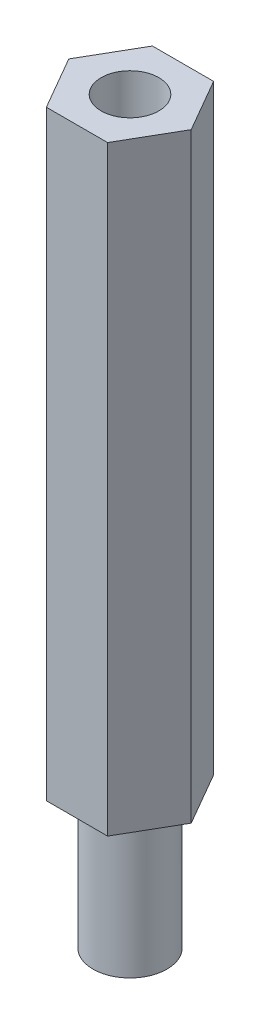
ISO-10303-21;
HEADER;
FILE_DESCRIPTION(('STEP AP214'),'2;1');
FILE_NAME('part.step','',(''),(''),'','','');
FILE_SCHEMA(('AUTOMOTIVE_DESIGN { 1 0 10303 214 1 1 1 1 }'));
ENDSEC;
DATA;
#1=APPLICATION_CONTEXT('core data for automotive mechanical design processes');
#2=APPLICATION_PROTOCOL_DEFINITION('international standard','automotive_design',2000,#1);
#3=PRODUCT_CONTEXT('',#1,'mechanical');
#4=PRODUCT('Part','Part','',(#3));
#5=PRODUCT_RELATED_PRODUCT_CATEGORY('part','',(#4));
#6=PRODUCT_DEFINITION_FORMATION('','',#4);
#7=PRODUCT_DEFINITION_CONTEXT('part definition',#1,'design');
#8=PRODUCT_DEFINITION('design','',#6,#7);
#9=PRODUCT_DEFINITION_SHAPE('','',#8);
#10=(LENGTH_UNIT() NAMED_UNIT(*) SI_UNIT(.MILLI.,.METRE.));
#11=(NAMED_UNIT(*) PLANE_ANGLE_UNIT() SI_UNIT($,.RADIAN.));
#12=(NAMED_UNIT(*) SI_UNIT($,.STERADIAN.) SOLID_ANGLE_UNIT());
#13=UNCERTAINTY_MEASURE_WITH_UNIT(LENGTH_MEASURE(1.E-05),#10,'distance_accuracy_value','');
#14=(GEOMETRIC_REPRESENTATION_CONTEXT(3) GLOBAL_UNCERTAINTY_ASSIGNED_CONTEXT((#13)) GLOBAL_UNIT_ASSIGNED_CONTEXT((#10,
#11,#12)) REPRESENTATION_CONTEXT('',''));
#15=CARTESIAN_POINT('',(0.,0.,0.));
#16=DIRECTION('',(0.,0.,1.));
#17=DIRECTION('',(1.,0.,0.));
#18=AXIS2_PLACEMENT_3D('',#15,#16,#17);
#19=CARTESIAN_POINT('',(-1.325,26.,2.29496732002876));
#20=DIRECTION('',(0.,0.,-1.));
#21=DIRECTION('',(-1.,0.,0.));
#22=AXIS2_PLACEMENT_3D('',#19,#20,#21);
#23=PLANE('',#22);
#24=DIRECTION('',(1.,0.,0.));
#25=VECTOR('',#24,1.);
#26=CARTESIAN_POINT('',(-1.325,0.,2.29496732002876));
#27=LINE('',#26,#25);
#28=CARTESIAN_POINT('',(-1.325,0.,2.29496732002876));
#29=VERTEX_POINT('',#28);
#30=CARTESIAN_POINT('',(1.325,0.,2.29496732002876));
#31=VERTEX_POINT('',#30);
#32=EDGE_CURVE('E122',#29,#31,#27,.T.);
#33=ORIENTED_EDGE('',*,*,#32,.T.);
#34=DIRECTION('',(0.,-1.,0.));
#35=VECTOR('',#34,1.);
#36=CARTESIAN_POINT('',(1.325,26.,2.29496732002876));
#37=LINE('',#36,#35);
#38=CARTESIAN_POINT('',(1.325,26.,2.29496732002876));
#39=VERTEX_POINT('',#38);
#40=EDGE_CURVE('E45',#39,#31,#37,.T.);
#41=ORIENTED_EDGE('',*,*,#40,.F.);
#42=DIRECTION('',(1.,0.,0.));
#43=VECTOR('',#42,1.);
#44=CARTESIAN_POINT('',(-1.325,26.,2.29496732002876));
#45=LINE('',#44,#43);
#46=CARTESIAN_POINT('',(-1.325,26.,2.29496732002876));
#47=VERTEX_POINT('',#46);
#48=EDGE_CURVE('E133',#47,#39,#45,.T.);
#49=ORIENTED_EDGE('',*,*,#48,.F.);
#50=DIRECTION('',(0.,-1.,0.));
#51=VECTOR('',#50,1.);
#52=CARTESIAN_POINT('',(-1.325,26.,2.29496732002876));
#53=LINE('',#52,#51);
#54=EDGE_CURVE('E118',#47,#29,#53,.T.);
#55=ORIENTED_EDGE('',*,*,#54,.T.);
#56=EDGE_LOOP('',(#33,#41,#49,#55));
#57=FACE_BOUND('',#56,.T.);
#58=ADVANCED_FACE('F37',(#57),#23,.F.);
#59=CARTESIAN_POINT('',(1.325,26.,2.29496732002876));
#60=DIRECTION('',(-0.866025403784439,0.,-0.5));
#61=DIRECTION('',(-0.5,0.,0.866025403784439));
#62=AXIS2_PLACEMENT_3D('',#59,#60,#61);
#63=PLANE('',#62);
#64=DIRECTION('',(0.5,0.,-0.866025403784439));
#65=VECTOR('',#64,1.);
#66=CARTESIAN_POINT('',(1.325,0.,2.29496732002876));
#67=LINE('',#66,#65);
#68=CARTESIAN_POINT('',(2.65,0.,0.));
#69=VERTEX_POINT('',#68);
#70=EDGE_CURVE('E125',#31,#69,#67,.T.);
#71=ORIENTED_EDGE('',*,*,#70,.T.);
#72=DIRECTION('',(0.,-1.,0.));
#73=VECTOR('',#72,1.);
#74=CARTESIAN_POINT('',(2.65,26.,0.));
#75=LINE('',#74,#73);
#76=CARTESIAN_POINT('',(2.65,26.,0.));
#77=VERTEX_POINT('',#76);
#78=EDGE_CURVE('E137',#77,#69,#75,.T.);
#79=ORIENTED_EDGE('',*,*,#78,.F.);
#80=DIRECTION('',(0.5,0.,-0.866025403784439));
#81=VECTOR('',#80,1.);
#82=CARTESIAN_POINT('',(1.325,26.,2.29496732002876));
#83=LINE('',#82,#81);
#84=EDGE_CURVE('E91',#39,#77,#83,.T.);
#85=ORIENTED_EDGE('',*,*,#84,.F.);
#86=ORIENTED_EDGE('',*,*,#40,.T.);
#87=EDGE_LOOP('',(#71,#79,#85,#86));
#88=FACE_BOUND('',#87,.T.);
#89=ADVANCED_FACE('F140',(#88),#63,.F.);
#90=CARTESIAN_POINT('',(2.65,26.,0.));
#91=DIRECTION('',(-0.866025403784438,0.,0.5));
#92=DIRECTION('',(0.5,0.,0.866025403784439));
#93=AXIS2_PLACEMENT_3D('',#90,#91,#92);
#94=PLANE('',#93);
#95=DIRECTION('',(-0.5,0.,-0.866025403784439));
#96=VECTOR('',#95,1.);
#97=CARTESIAN_POINT('',(2.65,0.,0.));
#98=LINE('',#97,#96);
#99=CARTESIAN_POINT('',(1.325,0.,-2.29496732002876));
#100=VERTEX_POINT('',#99);
#101=EDGE_CURVE('E128',#69,#100,#98,.T.);
#102=ORIENTED_EDGE('',*,*,#101,.T.);
#103=DIRECTION('',(0.,-1.,0.));
#104=VECTOR('',#103,1.);
#105=CARTESIAN_POINT('',(1.325,26.,-2.29496732002876));
#106=LINE('',#105,#104);
#107=CARTESIAN_POINT('',(1.325,26.,-2.29496732002876));
#108=VERTEX_POINT('',#107);
#109=EDGE_CURVE('E113',#108,#100,#106,.T.);
#110=ORIENTED_EDGE('',*,*,#109,.F.);
#111=DIRECTION('',(-0.5,0.,-0.866025403784439));
#112=VECTOR('',#111,1.);
#113=CARTESIAN_POINT('',(2.65,26.,0.));
#114=LINE('',#113,#112);
#115=EDGE_CURVE('E104',#77,#108,#114,.T.);
#116=ORIENTED_EDGE('',*,*,#115,.F.);
#117=ORIENTED_EDGE('',*,*,#78,.T.);
#118=EDGE_LOOP('',(#102,#110,#116,#117));
#119=FACE_BOUND('',#118,.T.);
#120=ADVANCED_FACE('F148',(#119),#94,.F.);
#121=CARTESIAN_POINT('',(1.325,26.,-2.29496732002876));
#122=DIRECTION('',(0.,0.,1.));
#123=DIRECTION('',(1.,0.,0.));
#124=AXIS2_PLACEMENT_3D('',#121,#122,#123);
#125=PLANE('',#124);
#126=DIRECTION('',(-1.,0.,0.));
#127=VECTOR('',#126,1.);
#128=CARTESIAN_POINT('',(1.325,0.,-2.29496732002876));
#129=LINE('',#128,#127);
#130=CARTESIAN_POINT('',(-1.325,0.,-2.29496732002876));
#131=VERTEX_POINT('',#130);
#132=EDGE_CURVE('E112',#100,#131,#129,.T.);
#133=ORIENTED_EDGE('',*,*,#132,.T.);
#134=DIRECTION('',(0.,-1.,0.));
#135=VECTOR('',#134,1.);
#136=CARTESIAN_POINT('',(-1.325,26.,-2.29496732002876));
#137=LINE('',#136,#135);
#138=CARTESIAN_POINT('',(-1.325,26.,-2.29496732002876));
#139=VERTEX_POINT('',#138);
#140=EDGE_CURVE('E109',#139,#131,#137,.T.);
#141=ORIENTED_EDGE('',*,*,#140,.F.);
#142=DIRECTION('',(-1.,0.,0.));
#143=VECTOR('',#142,1.);
#144=CARTESIAN_POINT('',(1.325,26.,-2.29496732002876));
#145=LINE('',#144,#143);
#146=EDGE_CURVE('E98',#108,#139,#145,.T.);
#147=ORIENTED_EDGE('',*,*,#146,.F.);
#148=ORIENTED_EDGE('',*,*,#109,.T.);
#149=EDGE_LOOP('',(#133,#141,#147,#148));
#150=FACE_BOUND('',#149,.T.);
#151=ADVANCED_FACE('F110',(#150),#125,.F.);
#152=CARTESIAN_POINT('',(-1.325,26.,-2.29496732002876));
#153=DIRECTION('',(0.866025403784439,0.,0.5));
#154=DIRECTION('',(0.5,0.,-0.866025403784439));
#155=AXIS2_PLACEMENT_3D('',#152,#153,#154);
#156=PLANE('',#155);
#157=DIRECTION('',(-0.5,0.,0.866025403784439));
#158=VECTOR('',#157,1.);
#159=CARTESIAN_POINT('',(-1.325,0.,-2.29496732002876));
#160=LINE('',#159,#158);
#161=CARTESIAN_POINT('',(-2.65,0.,0.));
#162=VERTEX_POINT('',#161);
#163=EDGE_CURVE('E76',#131,#162,#160,.T.);
#164=ORIENTED_EDGE('',*,*,#163,.T.);
#165=DIRECTION('',(0.,-1.,0.));
#166=VECTOR('',#165,1.);
#167=CARTESIAN_POINT('',(-2.65,26.,0.));
#168=LINE('',#167,#166);
#169=CARTESIAN_POINT('',(-2.65,26.,0.));
#170=VERTEX_POINT('',#169);
#171=EDGE_CURVE('E114',#170,#162,#168,.T.);
#172=ORIENTED_EDGE('',*,*,#171,.F.);
#173=DIRECTION('',(-0.5,0.,0.866025403784439));
#174=VECTOR('',#173,1.);
#175=CARTESIAN_POINT('',(-1.325,26.,-2.29496732002876));
#176=LINE('',#175,#174);
#177=EDGE_CURVE('E102',#139,#170,#176,.T.);
#178=ORIENTED_EDGE('',*,*,#177,.F.);
#179=ORIENTED_EDGE('',*,*,#140,.T.);
#180=EDGE_LOOP('',(#164,#172,#178,#179));
#181=FACE_BOUND('',#180,.T.);
#182=ADVANCED_FACE('F116',(#181),#156,.F.);
#183=CARTESIAN_POINT('',(-2.65,26.,0.));
#184=DIRECTION('',(0.866025403784438,0.,-0.5));
#185=DIRECTION('',(-0.5,0.,-0.866025403784439));
#186=AXIS2_PLACEMENT_3D('',#183,#184,#185);
#187=PLANE('',#186);
#188=DIRECTION('',(0.5,0.,0.866025403784439));
#189=VECTOR('',#188,1.);
#190=CARTESIAN_POINT('',(-2.65,0.,0.));
#191=LINE('',#190,#189);
#192=EDGE_CURVE('E82',#162,#29,#191,.T.);
#193=ORIENTED_EDGE('',*,*,#192,.T.);
#194=ORIENTED_EDGE('',*,*,#54,.F.);
#195=DIRECTION('',(0.5,0.,0.866025403784439));
#196=VECTOR('',#195,1.);
#197=CARTESIAN_POINT('',(-2.65,26.,0.));
#198=LINE('',#197,#196);
#199=EDGE_CURVE('E53',#170,#47,#198,.T.);
#200=ORIENTED_EDGE('',*,*,#199,.F.);
#201=ORIENTED_EDGE('',*,*,#171,.T.);
#202=EDGE_LOOP('',(#193,#194,#200,#201));
#203=FACE_BOUND('',#202,.T.);
#204=ADVANCED_FACE('F171',(#203),#187,.F.);
#205=CARTESIAN_POINT('',(0.,26.,0.));
#206=DIRECTION('',(0.,1.,0.));
#207=DIRECTION('',(0.,0.,1.));
#208=AXIS2_PLACEMENT_3D('',#205,#206,#207);
#209=PLANE('',#208);
#210=CARTESIAN_POINT('',(0.,26.,0.));
#211=DIRECTION('',(0.,1.,0.));
#212=DIRECTION('',(0.,0.,1.));
#213=AXIS2_PLACEMENT_3D('',#210,#211,#212);
#214=CIRCLE('',#213,1.25);
#215=CARTESIAN_POINT('',(0.,26.,1.25));
#216=VERTEX_POINT('',#215);
#217=EDGE_CURVE('E155',#216,#216,#214,.T.);
#218=ORIENTED_EDGE('',*,*,#217,.F.);
#219=EDGE_LOOP('',(#218));
#220=FACE_BOUND('',#219,.T.);
#221=ORIENTED_EDGE('',*,*,#48,.T.);
#222=ORIENTED_EDGE('',*,*,#84,.T.);
#223=ORIENTED_EDGE('',*,*,#115,.T.);
#224=ORIENTED_EDGE('',*,*,#146,.T.);
#225=ORIENTED_EDGE('',*,*,#177,.T.);
#226=ORIENTED_EDGE('',*,*,#199,.T.);
#227=EDGE_LOOP('',(#221,#222,#223,#224,#225,#226));
#228=FACE_BOUND('',#227,.T.);
#229=ADVANCED_FACE('F100',(#220,#228),#209,.T.);
#230=CARTESIAN_POINT('',(0.,0.,0.));
#231=DIRECTION('',(0.,1.,0.));
#232=DIRECTION('',(0.,0.,1.));
#233=AXIS2_PLACEMENT_3D('',#230,#231,#232);
#234=PLANE('',#233);
#235=CARTESIAN_POINT('',(0.,0.,0.));
#236=DIRECTION('',(0.,1.,0.));
#237=DIRECTION('',(0.,0.,1.));
#238=AXIS2_PLACEMENT_3D('',#235,#236,#237);
#239=CIRCLE('',#238,1.6);
#240=CARTESIAN_POINT('',(0.,0.,1.6));
#241=VERTEX_POINT('',#240);
#242=EDGE_CURVE('E11',#241,#241,#239,.F.);
#243=ORIENTED_EDGE('',*,*,#242,.F.);
#244=EDGE_LOOP('',(#243));
#245=FACE_BOUND('',#244,.T.);
#246=ORIENTED_EDGE('',*,*,#32,.F.);
#247=ORIENTED_EDGE('',*,*,#192,.F.);
#248=ORIENTED_EDGE('',*,*,#163,.F.);
#249=ORIENTED_EDGE('',*,*,#132,.F.);
#250=ORIENTED_EDGE('',*,*,#101,.F.);
#251=ORIENTED_EDGE('',*,*,#70,.F.);
#252=EDGE_LOOP('',(#246,#247,#248,#249,#250,#251));
#253=FACE_BOUND('',#252,.T.);
#254=ADVANCED_FACE('F145',(#245,#253),#234,.F.);
#255=CARTESIAN_POINT('',(0.,-6.,0.));
#256=DIRECTION('',(0.,1.,0.));
#257=DIRECTION('',(0.,0.,1.));
#258=AXIS2_PLACEMENT_3D('',#255,#256,#257);
#259=CYLINDRICAL_SURFACE('',#258,1.6);
#260=CARTESIAN_POINT('',(0.,-6.,0.));
#261=DIRECTION('',(0.,-1.,0.));
#262=DIRECTION('',(0.,0.,-1.));
#263=AXIS2_PLACEMENT_3D('',#260,#261,#262);
#264=CIRCLE('',#263,1.6);
#265=CARTESIAN_POINT('',(0.,-6.,-1.6));
#266=VERTEX_POINT('',#265);
#267=EDGE_CURVE('E126',#266,#266,#264,.T.);
#268=ORIENTED_EDGE('',*,*,#267,.F.);
#269=EDGE_LOOP('',(#268));
#270=FACE_BOUND('',#269,.T.);
#271=ORIENTED_EDGE('',*,*,#242,.T.);
#272=EDGE_LOOP('',(#271));
#273=FACE_BOUND('',#272,.T.);
#274=ADVANCED_FACE('F177',(#270,#273),#259,.T.);
#275=CARTESIAN_POINT('',(0.,-6.,0.));
#276=DIRECTION('',(0.,-1.,0.));
#277=DIRECTION('',(0.,0.,-1.));
#278=AXIS2_PLACEMENT_3D('',#275,#276,#277);
#279=PLANE('',#278);
#280=ORIENTED_EDGE('',*,*,#267,.T.);
#281=EDGE_LOOP('',(#280));
#282=FACE_BOUND('',#281,.T.);
#283=ADVANCED_FACE('F166',(#282),#279,.T.);
#284=CARTESIAN_POINT('',(0.,21.,0.));
#285=DIRECTION('',(0.,1.,0.));
#286=DIRECTION('',(0.,0.,1.));
#287=AXIS2_PLACEMENT_3D('',#284,#285,#286);
#288=CYLINDRICAL_SURFACE('',#287,1.25);
#289=CARTESIAN_POINT('',(0.,21.,0.));
#290=DIRECTION('',(0.,1.,0.));
#291=DIRECTION('',(0.,0.,1.));
#292=AXIS2_PLACEMENT_3D('',#289,#290,#291);
#293=CIRCLE('',#292,1.25);
#294=CARTESIAN_POINT('',(0.,21.,1.25));
#295=VERTEX_POINT('',#294);
#296=EDGE_CURVE('E154',#295,#295,#293,.T.);
#297=ORIENTED_EDGE('',*,*,#296,.F.);
#298=EDGE_LOOP('',(#297));
#299=FACE_BOUND('',#298,.T.);
#300=ORIENTED_EDGE('',*,*,#217,.T.);
#301=EDGE_LOOP('',(#300));
#302=FACE_BOUND('',#301,.T.);
#303=ADVANCED_FACE('F163',(#299,#302),#288,.F.);
#304=CARTESIAN_POINT('',(0.,21.,0.));
#305=DIRECTION('',(0.,1.,0.));
#306=DIRECTION('',(0.,0.,1.));
#307=AXIS2_PLACEMENT_3D('',#304,#305,#306);
#308=PLANE('',#307);
#309=ORIENTED_EDGE('',*,*,#296,.T.);
#310=EDGE_LOOP('',(#309));
#311=FACE_BOUND('',#310,.T.);
#312=ADVANCED_FACE('F161',(#311),#308,.T.);
#313=CLOSED_SHELL('',(#58,#89,#120,#151,#182,#204,#229,#254,#274,#283,#303,#312));
#314=MANIFOLD_SOLID_BREP('B2',#313);
#315=ADVANCED_BREP_SHAPE_REPRESENTATION('',(#18,#314),#14);
#316=SHAPE_DEFINITION_REPRESENTATION(#9,#315);
ENDSEC;
END-ISO-10303-21;
